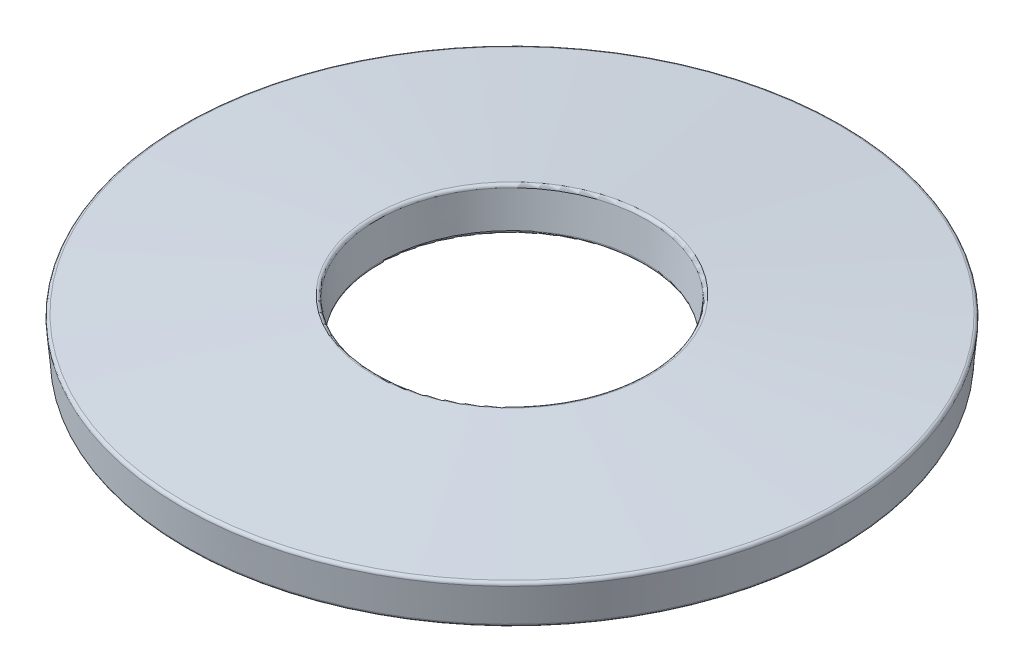
ISO-10303-21;
HEADER;
FILE_DESCRIPTION(('STEP AP214'),'2;1');
FILE_NAME('part.step','',(''),(''),'','','');
FILE_SCHEMA(('AUTOMOTIVE_DESIGN { 1 0 10303 214 1 1 1 1 }'));
ENDSEC;
DATA;
#1=APPLICATION_CONTEXT('core data for automotive mechanical design processes');
#2=APPLICATION_PROTOCOL_DEFINITION('international standard','automotive_design',2000,#1);
#3=PRODUCT_CONTEXT('',#1,'mechanical');
#4=PRODUCT('Part','Part','',(#3));
#5=PRODUCT_RELATED_PRODUCT_CATEGORY('part','',(#4));
#6=PRODUCT_DEFINITION_FORMATION('','',#4);
#7=PRODUCT_DEFINITION_CONTEXT('part definition',#1,'design');
#8=PRODUCT_DEFINITION('design','',#6,#7);
#9=PRODUCT_DEFINITION_SHAPE('','',#8);
#10=(LENGTH_UNIT() NAMED_UNIT(*) SI_UNIT(.MILLI.,.METRE.));
#11=(NAMED_UNIT(*) PLANE_ANGLE_UNIT() SI_UNIT($,.RADIAN.));
#12=(NAMED_UNIT(*) SI_UNIT($,.STERADIAN.) SOLID_ANGLE_UNIT());
#13=UNCERTAINTY_MEASURE_WITH_UNIT(LENGTH_MEASURE(1.E-05),#10,'distance_accuracy_value','');
#14=(GEOMETRIC_REPRESENTATION_CONTEXT(3) GLOBAL_UNCERTAINTY_ASSIGNED_CONTEXT((#13)) GLOBAL_UNIT_ASSIGNED_CONTEXT((#10,
#11,#12)) REPRESENTATION_CONTEXT('',''));
#15=CARTESIAN_POINT('',(0.,0.,0.));
#16=DIRECTION('',(0.,0.,1.));
#17=DIRECTION('',(1.,0.,0.));
#18=AXIS2_PLACEMENT_3D('',#15,#16,#17);
#19=CARTESIAN_POINT('',(0.,-0.148177566640684,0.));
#20=DIRECTION('',(0.,-1.,0.));
#21=DIRECTION('',(0.,0.,-1.));
#22=AXIS2_PLACEMENT_3D('',#19,#20,#21);
#23=CONICAL_SURFACE('',#22,1.6,1.48539043649645);
#24=CARTESIAN_POINT('',(0.,-0.151376395416947,0.));
#25=DIRECTION('',(0.,1.,0.));
#26=DIRECTION('',(0.,0.,1.));
#27=AXIS2_PLACEMENT_3D('',#24,#25,#26);
#28=CIRCLE('',#27,1.63736331749805);
#29=CARTESIAN_POINT('',(0.,-0.151376395416947,1.63736331749805));
#30=VERTEX_POINT('',#29);
#31=EDGE_CURVE('E56',#30,#30,#28,.T.);
#32=ORIENTED_EDGE('',*,*,#31,.T.);
#33=EDGE_LOOP('',(#32));
#34=FACE_BOUND('',#33,.T.);
#35=CARTESIAN_POINT('',(0.,-0.346801171223742,0.));
#36=DIRECTION('',(0.,1.,0.));
#37=DIRECTION('',(0.,0.,1.));
#38=AXIS2_PLACEMENT_3D('',#35,#36,#37);
#39=CIRCLE('',#38,3.91998563215177);
#40=CARTESIAN_POINT('',(0.,-0.346801171223742,3.91998563215177));
#41=VERTEX_POINT('',#40);
#42=EDGE_CURVE('E59',#41,#41,#39,.F.);
#43=ORIENTED_EDGE('',*,*,#42,.T.);
#44=EDGE_LOOP('',(#43));
#45=FACE_BOUND('',#44,.T.);
#46=ADVANCED_FACE('F30',(#34,#45),#23,.F.);
#47=CARTESIAN_POINT('',(0.,0.349999999999994,0.));
#48=DIRECTION('',(0.,1.,0.));
#49=DIRECTION('',(0.,0.,1.));
#50=AXIS2_PLACEMENT_3D('',#47,#48,#49);
#51=CONICAL_SURFACE('',#50,1.64265105035017,0.085405890298445);
#52=CARTESIAN_POINT('',(0.,-0.110814249142631,0.));
#53=DIRECTION('',(0.,-1.,0.));
#54=DIRECTION('',(0.,0.,-1.));
#55=AXIS2_PLACEMENT_3D('',#52,#53,#54);
#56=CIRCLE('',#55,1.60319882877626);
#57=CARTESIAN_POINT('',(0.,-0.110814249142631,-1.60319882877626));
#58=VERTEX_POINT('',#57);
#59=EDGE_CURVE('E50',#58,#58,#56,.T.);
#60=ORIENTED_EDGE('',*,*,#59,.T.);
#61=EDGE_LOOP('',(#60));
#62=FACE_BOUND('',#61,.T.);
#63=CARTESIAN_POINT('',(0.,0.312636682501942,0.));
#64=DIRECTION('',(0.,-1.,0.));
#65=DIRECTION('',(0.,0.,-1.));
#66=AXIS2_PLACEMENT_3D('',#63,#64,#65);
#67=CIRCLE('',#66,1.63945222157391);
#68=CARTESIAN_POINT('',(0.,0.312636682501942,-1.63945222157391));
#69=VERTEX_POINT('',#68);
#70=EDGE_CURVE('E53',#69,#69,#67,.F.);
#71=ORIENTED_EDGE('',*,*,#70,.T.);
#72=EDGE_LOOP('',(#71));
#73=FACE_BOUND('',#72,.T.);
#74=ADVANCED_FACE('F86',(#62,#73),#51,.F.);
#75=CARTESIAN_POINT('',(0.,0.148177566640673,0.));
#76=DIRECTION('',(0.,-1.,0.));
#77=DIRECTION('',(0.,0.,-1.));
#78=AXIS2_PLACEMENT_3D('',#75,#76,#77);
#79=CONICAL_SURFACE('',#78,4.,1.48539043649645);
#80=CARTESIAN_POINT('',(0.,0.151376395416936,0.));
#81=DIRECTION('',(0.,1.,0.));
#82=DIRECTION('',(0.,0.,1.));
#83=AXIS2_PLACEMENT_3D('',#80,#81,#82);
#84=CIRCLE('',#83,3.96263668250195);
#85=CARTESIAN_POINT('',(0.,0.151376395416936,3.96263668250195));
#86=VERTEX_POINT('',#85);
#87=EDGE_CURVE('E10',#86,#86,#84,.T.);
#88=ORIENTED_EDGE('',*,*,#87,.T.);
#89=EDGE_LOOP('',(#88));
#90=FACE_BOUND('',#89,.T.);
#91=CARTESIAN_POINT('',(0.,0.346801171223731,0.));
#92=DIRECTION('',(0.,1.,0.));
#93=DIRECTION('',(0.,0.,1.));
#94=AXIS2_PLACEMENT_3D('',#91,#92,#93);
#95=CIRCLE('',#94,1.68001436784822);
#96=CARTESIAN_POINT('',(0.,0.346801171223731,1.68001436784822));
#97=VERTEX_POINT('',#96);
#98=EDGE_CURVE('E37',#97,#97,#95,.F.);
#99=ORIENTED_EDGE('',*,*,#98,.T.);
#100=EDGE_LOOP('',(#99));
#101=FACE_BOUND('',#100,.T.);
#102=ADVANCED_FACE('F75',(#90,#101),#79,.T.);
#103=CARTESIAN_POINT('',(0.,-0.350000000000005,0.));
#104=DIRECTION('',(0.,1.,0.));
#105=DIRECTION('',(0.,0.,1.));
#106=AXIS2_PLACEMENT_3D('',#103,#104,#105);
#107=CONICAL_SURFACE('',#106,3.95734894964982,0.0854058902984727);
#108=CARTESIAN_POINT('',(0.,-0.312636682501949,0.));
#109=DIRECTION('',(0.,-1.,0.));
#110=DIRECTION('',(0.,0.,-1.));
#111=AXIS2_PLACEMENT_3D('',#108,#109,#110);
#112=CIRCLE('',#111,3.96054777842608);
#113=CARTESIAN_POINT('',(0.,-0.312636682501949,-3.96054777842608));
#114=VERTEX_POINT('',#113);
#115=EDGE_CURVE('E41',#114,#114,#112,.F.);
#116=ORIENTED_EDGE('',*,*,#115,.T.);
#117=EDGE_LOOP('',(#116));
#118=FACE_BOUND('',#117,.T.);
#119=CARTESIAN_POINT('',(0.,0.110814249142617,0.));
#120=DIRECTION('',(0.,-1.,0.));
#121=DIRECTION('',(0.,0.,-1.));
#122=AXIS2_PLACEMENT_3D('',#119,#120,#121);
#123=CIRCLE('',#122,3.99680117122374);
#124=CARTESIAN_POINT('',(0.,0.110814249142617,-3.99680117122374));
#125=VERTEX_POINT('',#124);
#126=EDGE_CURVE('E45',#125,#125,#123,.T.);
#127=ORIENTED_EDGE('',*,*,#126,.T.);
#128=EDGE_LOOP('',(#127));
#129=FACE_BOUND('',#128,.T.);
#130=ADVANCED_FACE('F72',(#118,#129),#107,.T.);
#131=CARTESIAN_POINT('',(0.,-0.114013077918896,0.));
#132=DIRECTION('',(0.,-1.,0.));
#133=DIRECTION('',(0.,0.,-1.));
#134=AXIS2_PLACEMENT_3D('',#131,#132,#133);
#135=TOROIDAL_SURFACE('',#134,1.64056214627431,0.0375);
#136=ORIENTED_EDGE('',*,*,#59,.F.);
#137=EDGE_LOOP('',(#136));
#138=FACE_BOUND('',#137,.T.);
#139=ORIENTED_EDGE('',*,*,#31,.F.);
#140=EDGE_LOOP('',(#139));
#141=FACE_BOUND('',#140,.T.);
#142=ADVANCED_FACE('F68',(#138,#141),#135,.T.);
#143=CARTESIAN_POINT('',(0.,-0.309437853725691,0.));
#144=DIRECTION('',(0.,-1.,0.));
#145=DIRECTION('',(0.,0.,-1.));
#146=AXIS2_PLACEMENT_3D('',#143,#144,#145);
#147=TOROIDAL_SURFACE('',#146,3.92318446092803,0.0375);
#148=ORIENTED_EDGE('',*,*,#42,.F.);
#149=EDGE_LOOP('',(#148));
#150=FACE_BOUND('',#149,.T.);
#151=ORIENTED_EDGE('',*,*,#115,.F.);
#152=EDGE_LOOP('',(#151));
#153=FACE_BOUND('',#152,.T.);
#154=ADVANCED_FACE('F64',(#150,#153),#147,.T.);
#155=CARTESIAN_POINT('',(0.,0.114013077918885,0.));
#156=DIRECTION('',(0.,-1.,0.));
#157=DIRECTION('',(0.,0.,-1.));
#158=AXIS2_PLACEMENT_3D('',#155,#156,#157);
#159=TOROIDAL_SURFACE('',#158,3.95943785372569,0.0375);
#160=ORIENTED_EDGE('',*,*,#126,.F.);
#161=EDGE_LOOP('',(#160));
#162=FACE_BOUND('',#161,.T.);
#163=ORIENTED_EDGE('',*,*,#87,.F.);
#164=EDGE_LOOP('',(#163));
#165=FACE_BOUND('',#164,.T.);
#166=ADVANCED_FACE('F67',(#162,#165),#159,.T.);
#167=CARTESIAN_POINT('',(0.,0.30943785372568,0.));
#168=DIRECTION('',(0.,-1.,0.));
#169=DIRECTION('',(0.,0.,-1.));
#170=AXIS2_PLACEMENT_3D('',#167,#168,#169);
#171=TOROIDAL_SURFACE('',#170,1.67681553907196,0.0375);
#172=ORIENTED_EDGE('',*,*,#98,.F.);
#173=EDGE_LOOP('',(#172));
#174=FACE_BOUND('',#173,.T.);
#175=ORIENTED_EDGE('',*,*,#70,.F.);
#176=EDGE_LOOP('',(#175));
#177=FACE_BOUND('',#176,.T.);
#178=ADVANCED_FACE('F32',(#174,#177),#171,.T.);
#179=CLOSED_SHELL('',(#46,#74,#102,#130,#142,#154,#166,#178));
#180=MANIFOLD_SOLID_BREP('B2',#179);
#181=ADVANCED_BREP_SHAPE_REPRESENTATION('',(#18,#180),#14);
#182=SHAPE_DEFINITION_REPRESENTATION(#9,#181);
ENDSEC;
END-ISO-10303-21;
